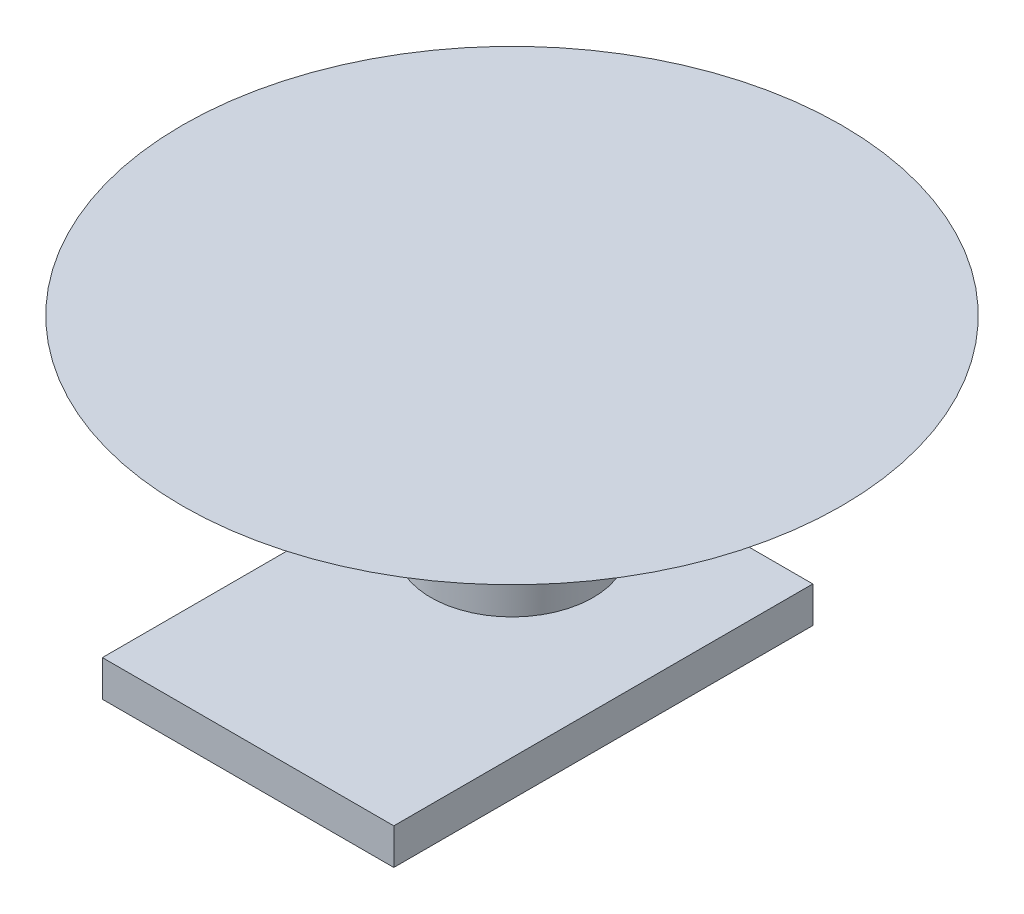
ISO-10303-21;
HEADER;
FILE_DESCRIPTION(('STEP AP214'),'2;1');
FILE_NAME('part.step','',(''),(''),'','','');
FILE_SCHEMA(('AUTOMOTIVE_DESIGN { 1 0 10303 214 1 1 1 1 }'));
ENDSEC;
DATA;
#1=APPLICATION_CONTEXT('core data for automotive mechanical design processes');
#2=APPLICATION_PROTOCOL_DEFINITION('international standard','automotive_design',2000,#1);
#3=PRODUCT_CONTEXT('',#1,'mechanical');
#4=PRODUCT('Part','Part','',(#3));
#5=PRODUCT_RELATED_PRODUCT_CATEGORY('part','',(#4));
#6=PRODUCT_DEFINITION_FORMATION('','',#4);
#7=PRODUCT_DEFINITION_CONTEXT('part definition',#1,'design');
#8=PRODUCT_DEFINITION('design','',#6,#7);
#9=PRODUCT_DEFINITION_SHAPE('','',#8);
#10=(LENGTH_UNIT() NAMED_UNIT(*) SI_UNIT(.MILLI.,.METRE.));
#11=(NAMED_UNIT(*) PLANE_ANGLE_UNIT() SI_UNIT($,.RADIAN.));
#12=(NAMED_UNIT(*) SI_UNIT($,.STERADIAN.) SOLID_ANGLE_UNIT());
#13=UNCERTAINTY_MEASURE_WITH_UNIT(LENGTH_MEASURE(1.E-05),#10,'distance_accuracy_value','');
#14=(GEOMETRIC_REPRESENTATION_CONTEXT(3) GLOBAL_UNCERTAINTY_ASSIGNED_CONTEXT((#13)) GLOBAL_UNIT_ASSIGNED_CONTEXT((#10,
#11,#12)) REPRESENTATION_CONTEXT('',''));
#15=CARTESIAN_POINT('',(0.,0.,0.));
#16=DIRECTION('',(0.,0.,1.));
#17=DIRECTION('',(1.,0.,0.));
#18=AXIS2_PLACEMENT_3D('',#15,#16,#17);
#19=CARTESIAN_POINT('',(-4.71170000000001,33.7432214682509,-58.777909248244));
#20=DIRECTION('',(0.,-1.,0.));
#21=DIRECTION('',(0.,0.,-1.));
#22=AXIS2_PLACEMENT_3D('',#19,#20,#21);
#23=PLANE('',#22);
#24=CARTESIAN_POINT('',(-4.71170000000001,33.7432214682508,-12.3698));
#25=DIRECTION('',(0.,1.,0.));
#26=DIRECTION('',(0.,0.,1.));
#27=AXIS2_PLACEMENT_3D('',#24,#25,#26);
#28=CIRCLE('',#27,46.408109248244);
#29=CARTESIAN_POINT('',(-4.71170000000001,33.7432214682508,34.0383092482441));
#30=VERTEX_POINT('',#29);
#31=EDGE_CURVE('E12',#30,#30,#28,.T.);
#32=ORIENTED_EDGE('',*,*,#31,.T.);
#33=EDGE_LOOP('',(#32));
#34=FACE_BOUND('',#33,.T.);
#35=ADVANCED_FACE('F51',(#34),#23,.F.);
#36=CARTESIAN_POINT('',(-4.71170000000001,13.081,-12.3698));
#37=DIRECTION('',(0.,1.,0.));
#38=DIRECTION('',(0.,0.,1.));
#39=AXIS2_PLACEMENT_3D('',#36,#37,#38);
#40=CONICAL_SURFACE('',#39,0.,1.15191730631625);
#41=ORIENTED_EDGE('',*,*,#31,.F.);
#42=EDGE_LOOP('',(#41));
#43=FACE_BOUND('',#42,.T.);
#44=CARTESIAN_POINT('',(-4.71170000000001,13.081,-12.3698));
#45=VERTEX_POINT('',#44);
#46=VERTEX_LOOP('',#45);
#47=FACE_BOUND('',#46,.T.);
#48=ADVANCED_FACE('F60',(#43,#47),#40,.T.);
#49=CLOSED_SHELL('',(#35,#48));
#50=MANIFOLD_SOLID_BREP('B2',#49);
#51=CARTESIAN_POINT('',(0.,5.08,0.));
#52=DIRECTION('',(0.,-1.,0.));
#53=DIRECTION('',(0.,0.,-1.));
#54=AXIS2_PLACEMENT_3D('',#51,#52,#53);
#55=PLANE('',#54);
#56=DIRECTION('',(0.,0.,-1.));
#57=VECTOR('',#56,1.);
#58=CARTESIAN_POINT('',(20.5105,5.08,29.4894));
#59=LINE('',#58,#57);
#60=CARTESIAN_POINT('',(20.5105,5.08,29.4894));
#61=VERTEX_POINT('',#60);
#62=CARTESIAN_POINT('',(20.5105,5.08,-29.4894));
#63=VERTEX_POINT('',#62);
#64=EDGE_CURVE('E145',#61,#63,#59,.T.);
#65=ORIENTED_EDGE('',*,*,#64,.T.);
#66=DIRECTION('',(-1.,0.,0.));
#67=VECTOR('',#66,1.);
#68=CARTESIAN_POINT('',(-20.5105,5.08,-29.4894));
#69=LINE('',#68,#67);
#70=CARTESIAN_POINT('',(-20.5105,5.08,-29.4894));
#71=VERTEX_POINT('',#70);
#72=EDGE_CURVE('E140',#63,#71,#69,.T.);
#73=ORIENTED_EDGE('',*,*,#72,.T.);
#74=DIRECTION('',(0.,0.,1.));
#75=VECTOR('',#74,1.);
#76=CARTESIAN_POINT('',(-20.5105,5.08,29.4894));
#77=LINE('',#76,#75);
#78=CARTESIAN_POINT('',(-20.5105,5.08,29.4894));
#79=VERTEX_POINT('',#78);
#80=EDGE_CURVE('E143',#71,#79,#77,.T.);
#81=ORIENTED_EDGE('',*,*,#80,.T.);
#82=DIRECTION('',(1.,0.,0.));
#83=VECTOR('',#82,1.);
#84=CARTESIAN_POINT('',(-20.5105,5.08,29.4894));
#85=LINE('',#84,#83);
#86=EDGE_CURVE('E103',#79,#61,#85,.T.);
#87=ORIENTED_EDGE('',*,*,#86,.T.);
#88=EDGE_LOOP('',(#65,#73,#81,#87));
#89=FACE_BOUND('',#88,.T.);
#90=CARTESIAN_POINT('',(-4.71170000000001,5.08,-12.3698));
#91=DIRECTION('',(0.,-1.,0.));
#92=DIRECTION('',(0.,0.,-1.));
#93=AXIS2_PLACEMENT_3D('',#90,#91,#92);
#94=CIRCLE('',#93,11.43);
#95=CARTESIAN_POINT('',(-4.71170000000001,5.08,-23.7998));
#96=VERTEX_POINT('',#95);
#97=EDGE_CURVE('E49',#96,#96,#94,.F.);
#98=ORIENTED_EDGE('',*,*,#97,.F.);
#99=EDGE_LOOP('',(#98));
#100=FACE_BOUND('',#99,.T.);
#101=ADVANCED_FACE('F85',(#89,#100),#55,.F.);
#102=CARTESIAN_POINT('',(20.5105,5.08,29.4894));
#103=DIRECTION('',(-1.,0.,0.));
#104=DIRECTION('',(0.,0.,1.));
#105=AXIS2_PLACEMENT_3D('',#102,#103,#104);
#106=PLANE('',#105);
#107=DIRECTION('',(0.,0.,-1.));
#108=VECTOR('',#107,1.);
#109=CARTESIAN_POINT('',(20.5105,0.,29.4894));
#110=LINE('',#109,#108);
#111=CARTESIAN_POINT('',(20.5105,0.,29.4894));
#112=VERTEX_POINT('',#111);
#113=CARTESIAN_POINT('',(20.5105,0.,-29.4894));
#114=VERTEX_POINT('',#113);
#115=EDGE_CURVE('E163',#112,#114,#110,.T.);
#116=ORIENTED_EDGE('',*,*,#115,.T.);
#117=DIRECTION('',(0.,-1.,0.));
#118=VECTOR('',#117,1.);
#119=CARTESIAN_POINT('',(20.5105,5.08,-29.4894));
#120=LINE('',#119,#118);
#121=EDGE_CURVE('E95',#63,#114,#120,.T.);
#122=ORIENTED_EDGE('',*,*,#121,.F.);
#123=ORIENTED_EDGE('',*,*,#64,.F.);
#124=DIRECTION('',(0.,-1.,0.));
#125=VECTOR('',#124,1.);
#126=CARTESIAN_POINT('',(20.5105,5.08,29.4894));
#127=LINE('',#126,#125);
#128=EDGE_CURVE('E159',#61,#112,#127,.T.);
#129=ORIENTED_EDGE('',*,*,#128,.T.);
#130=EDGE_LOOP('',(#116,#122,#123,#129));
#131=FACE_BOUND('',#130,.T.);
#132=ADVANCED_FACE('F87',(#131),#106,.F.);
#133=CARTESIAN_POINT('',(-20.5105,5.08,-29.4894));
#134=DIRECTION('',(0.,0.,1.));
#135=DIRECTION('',(1.,0.,0.));
#136=AXIS2_PLACEMENT_3D('',#133,#134,#135);
#137=PLANE('',#136);
#138=DIRECTION('',(-1.,0.,0.));
#139=VECTOR('',#138,1.);
#140=CARTESIAN_POINT('',(-20.5105,0.,-29.4894));
#141=LINE('',#140,#139);
#142=CARTESIAN_POINT('',(-20.5105,0.,-29.4894));
#143=VERTEX_POINT('',#142);
#144=EDGE_CURVE('E151',#114,#143,#141,.T.);
#145=ORIENTED_EDGE('',*,*,#144,.T.);
#146=DIRECTION('',(0.,-1.,0.));
#147=VECTOR('',#146,1.);
#148=CARTESIAN_POINT('',(-20.5105,5.08,-29.4894));
#149=LINE('',#148,#147);
#150=EDGE_CURVE('E149',#71,#143,#149,.T.);
#151=ORIENTED_EDGE('',*,*,#150,.F.);
#152=ORIENTED_EDGE('',*,*,#72,.F.);
#153=ORIENTED_EDGE('',*,*,#121,.T.);
#154=EDGE_LOOP('',(#145,#151,#152,#153));
#155=FACE_BOUND('',#154,.T.);
#156=ADVANCED_FACE('F150',(#155),#137,.F.);
#157=CARTESIAN_POINT('',(-20.5105,5.08,29.4894));
#158=DIRECTION('',(1.,0.,0.));
#159=DIRECTION('',(0.,0.,-1.));
#160=AXIS2_PLACEMENT_3D('',#157,#158,#159);
#161=PLANE('',#160);
#162=DIRECTION('',(0.,0.,1.));
#163=VECTOR('',#162,1.);
#164=CARTESIAN_POINT('',(-20.5105,0.,29.4894));
#165=LINE('',#164,#163);
#166=CARTESIAN_POINT('',(-20.5105,0.,29.4894));
#167=VERTEX_POINT('',#166);
#168=EDGE_CURVE('E124',#143,#167,#165,.T.);
#169=ORIENTED_EDGE('',*,*,#168,.T.);
#170=DIRECTION('',(0.,-1.,0.));
#171=VECTOR('',#170,1.);
#172=CARTESIAN_POINT('',(-20.5105,5.08,29.4894));
#173=LINE('',#172,#171);
#174=EDGE_CURVE('E153',#79,#167,#173,.T.);
#175=ORIENTED_EDGE('',*,*,#174,.F.);
#176=ORIENTED_EDGE('',*,*,#80,.F.);
#177=ORIENTED_EDGE('',*,*,#150,.T.);
#178=EDGE_LOOP('',(#169,#175,#176,#177));
#179=FACE_BOUND('',#178,.T.);
#180=ADVANCED_FACE('F155',(#179),#161,.F.);
#181=CARTESIAN_POINT('',(-20.5105,5.08,29.4894));
#182=DIRECTION('',(0.,0.,-1.));
#183=DIRECTION('',(-1.,0.,0.));
#184=AXIS2_PLACEMENT_3D('',#181,#182,#183);
#185=PLANE('',#184);
#186=DIRECTION('',(1.,0.,0.));
#187=VECTOR('',#186,1.);
#188=CARTESIAN_POINT('',(-20.5105,0.,29.4894));
#189=LINE('',#188,#187);
#190=EDGE_CURVE('E130',#167,#112,#189,.T.);
#191=ORIENTED_EDGE('',*,*,#190,.T.);
#192=ORIENTED_EDGE('',*,*,#128,.F.);
#193=ORIENTED_EDGE('',*,*,#86,.F.);
#194=ORIENTED_EDGE('',*,*,#174,.T.);
#195=EDGE_LOOP('',(#191,#192,#193,#194));
#196=FACE_BOUND('',#195,.T.);
#197=ADVANCED_FACE('F185',(#196),#185,.F.);
#198=CARTESIAN_POINT('',(0.,0.,0.));
#199=DIRECTION('',(0.,-1.,0.));
#200=DIRECTION('',(0.,0.,-1.));
#201=AXIS2_PLACEMENT_3D('',#198,#199,#200);
#202=PLANE('',#201);
#203=ORIENTED_EDGE('',*,*,#115,.F.);
#204=ORIENTED_EDGE('',*,*,#190,.F.);
#205=ORIENTED_EDGE('',*,*,#168,.F.);
#206=ORIENTED_EDGE('',*,*,#144,.F.);
#207=EDGE_LOOP('',(#203,#204,#205,#206));
#208=FACE_BOUND('',#207,.T.);
#209=ADVANCED_FACE('F182',(#208),#202,.T.);
#210=CARTESIAN_POINT('',(-4.71170000000001,13.081,-12.3698));
#211=DIRECTION('',(0.,-1.,0.));
#212=DIRECTION('',(0.,0.,-1.));
#213=AXIS2_PLACEMENT_3D('',#210,#211,#212);
#214=CYLINDRICAL_SURFACE('',#213,11.43);
#215=CARTESIAN_POINT('',(-4.71170000000001,13.081,-12.3698));
#216=DIRECTION('',(0.,1.,0.));
#217=DIRECTION('',(0.,0.,1.));
#218=AXIS2_PLACEMENT_3D('',#215,#216,#217);
#219=CIRCLE('',#218,11.43);
#220=CARTESIAN_POINT('',(-4.71170000000001,13.081,-0.939799999999991));
#221=VERTEX_POINT('',#220);
#222=EDGE_CURVE('E167',#221,#221,#219,.T.);
#223=ORIENTED_EDGE('',*,*,#222,.F.);
#224=EDGE_LOOP('',(#223));
#225=FACE_BOUND('',#224,.T.);
#226=ORIENTED_EDGE('',*,*,#97,.T.);
#227=EDGE_LOOP('',(#226));
#228=FACE_BOUND('',#227,.T.);
#229=ADVANCED_FACE('F184',(#225,#228),#214,.T.);
#230=CARTESIAN_POINT('',(-4.71170000000001,13.081,-12.3698));
#231=DIRECTION('',(0.,1.,0.));
#232=DIRECTION('',(0.,0.,1.));
#233=AXIS2_PLACEMENT_3D('',#230,#231,#232);
#234=PLANE('',#233);
#235=ORIENTED_EDGE('',*,*,#222,.T.);
#236=EDGE_LOOP('',(#235));
#237=FACE_BOUND('',#236,.T.);
#238=ADVANCED_FACE('F191',(#237),#234,.T.);
#239=CLOSED_SHELL('',(#101,#132,#156,#180,#197,#209,#229,#238));
#240=MANIFOLD_SOLID_BREP('B6',#239);
#241=ADVANCED_BREP_SHAPE_REPRESENTATION('',(#18,#50,#240),#14);
#242=SHAPE_DEFINITION_REPRESENTATION(#9,#241);
ENDSEC;
END-ISO-10303-21;
